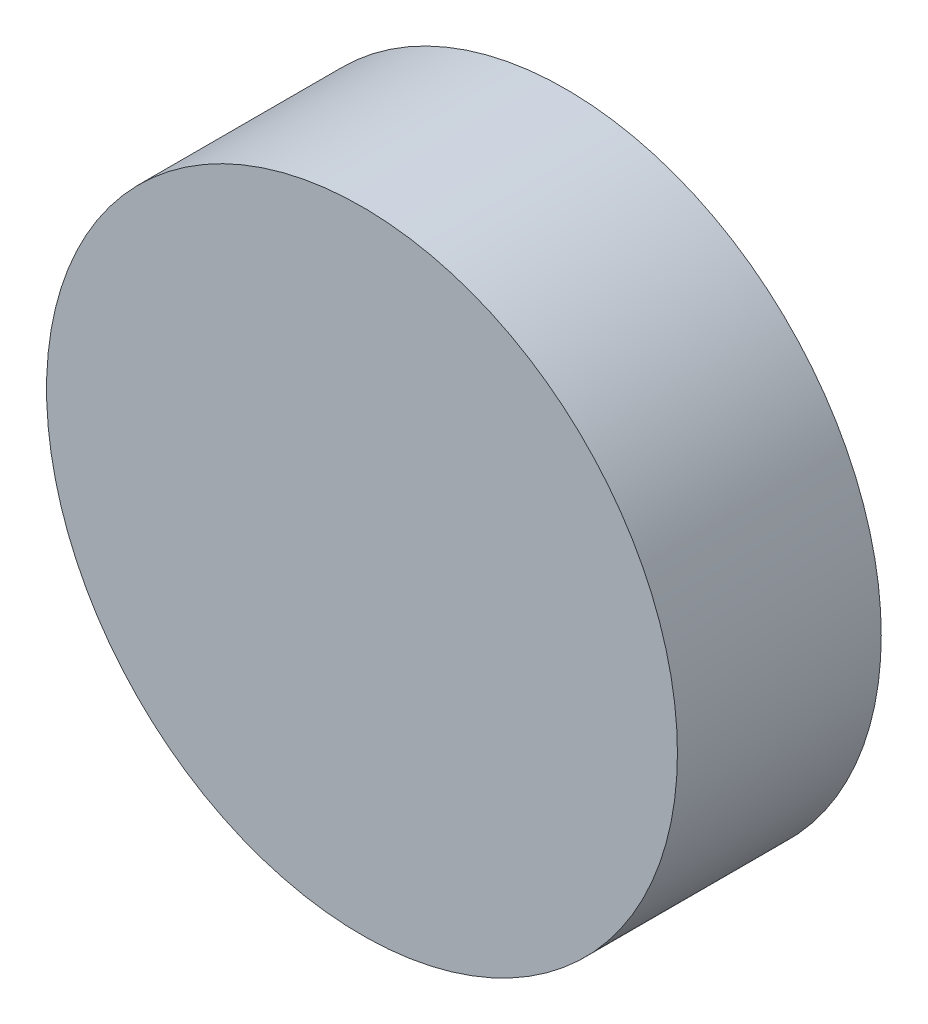
ISO-10303-21;
HEADER;
FILE_DESCRIPTION(('STEP AP214'),'2;1');
FILE_NAME('part.step','',(''),(''),'','','');
FILE_SCHEMA(('AUTOMOTIVE_DESIGN { 1 0 10303 214 1 1 1 1 }'));
ENDSEC;
DATA;
#1=APPLICATION_CONTEXT('core data for automotive mechanical design processes');
#2=APPLICATION_PROTOCOL_DEFINITION('international standard','automotive_design',2000,#1);
#3=PRODUCT_CONTEXT('',#1,'mechanical');
#4=PRODUCT('Part','Part','',(#3));
#5=PRODUCT_RELATED_PRODUCT_CATEGORY('part','',(#4));
#6=PRODUCT_DEFINITION_FORMATION('','',#4);
#7=PRODUCT_DEFINITION_CONTEXT('part definition',#1,'design');
#8=PRODUCT_DEFINITION('design','',#6,#7);
#9=PRODUCT_DEFINITION_SHAPE('','',#8);
#10=(LENGTH_UNIT() NAMED_UNIT(*) SI_UNIT(.MILLI.,.METRE.));
#11=(NAMED_UNIT(*) PLANE_ANGLE_UNIT() SI_UNIT($,.RADIAN.));
#12=(NAMED_UNIT(*) SI_UNIT($,.STERADIAN.) SOLID_ANGLE_UNIT());
#13=UNCERTAINTY_MEASURE_WITH_UNIT(LENGTH_MEASURE(1.E-05),#10,'distance_accuracy_value','');
#14=(GEOMETRIC_REPRESENTATION_CONTEXT(3) GLOBAL_UNCERTAINTY_ASSIGNED_CONTEXT((#13)) GLOBAL_UNIT_ASSIGNED_CONTEXT((#10,
#11,#12)) REPRESENTATION_CONTEXT('',''));
#15=CARTESIAN_POINT('',(0.,0.,0.));
#16=DIRECTION('',(0.,0.,1.));
#17=DIRECTION('',(1.,0.,0.));
#18=AXIS2_PLACEMENT_3D('',#15,#16,#17);
#19=CARTESIAN_POINT('',(0.,0.,0.));
#20=DIRECTION('',(0.,0.,1.));
#21=DIRECTION('',(1.,0.,0.));
#22=AXIS2_PLACEMENT_3D('',#19,#20,#21);
#23=PLANE('',#22);
#24=CARTESIAN_POINT('',(0.,0.,0.));
#25=DIRECTION('',(0.,0.,1.));
#26=DIRECTION('',(1.,0.,0.));
#27=AXIS2_PLACEMENT_3D('',#24,#25,#26);
#28=CIRCLE('',#27,6.5);
#29=CARTESIAN_POINT('',(6.5,0.,0.));
#30=VERTEX_POINT('',#29);
#31=EDGE_CURVE('E10',#30,#30,#28,.T.);
#32=ORIENTED_EDGE('',*,*,#31,.F.);
#33=EDGE_LOOP('',(#32));
#34=FACE_BOUND('',#33,.T.);
#35=CARTESIAN_POINT('',(0.,0.,0.));
#36=DIRECTION('',(0.,0.,1.));
#37=DIRECTION('',(1.,0.,0.));
#38=AXIS2_PLACEMENT_3D('',#35,#36,#37);
#39=CIRCLE('',#38,4.5);
#40=CARTESIAN_POINT('',(4.5,0.,0.));
#41=VERTEX_POINT('',#40);
#42=EDGE_CURVE('E40',#41,#41,#39,.T.);
#43=ORIENTED_EDGE('',*,*,#42,.T.);
#44=EDGE_LOOP('',(#43));
#45=FACE_BOUND('',#44,.T.);
#46=ADVANCED_FACE('F33',(#34,#45),#23,.F.);
#47=CARTESIAN_POINT('',(0.,0.,4.));
#48=DIRECTION('',(0.,0.,-1.));
#49=DIRECTION('',(-1.,0.,0.));
#50=AXIS2_PLACEMENT_3D('',#47,#48,#49);
#51=CYLINDRICAL_SURFACE('',#50,6.5);
#52=ORIENTED_EDGE('',*,*,#31,.T.);
#53=EDGE_LOOP('',(#52));
#54=FACE_BOUND('',#53,.T.);
#55=CARTESIAN_POINT('',(0.,0.,4.2));
#56=DIRECTION('',(0.,0.,1.));
#57=DIRECTION('',(1.,0.,0.));
#58=AXIS2_PLACEMENT_3D('',#55,#56,#57);
#59=CIRCLE('',#58,6.5);
#60=CARTESIAN_POINT('',(6.5,0.,4.2));
#61=VERTEX_POINT('',#60);
#62=EDGE_CURVE('E48',#61,#61,#59,.T.);
#63=ORIENTED_EDGE('',*,*,#62,.F.);
#64=EDGE_LOOP('',(#63));
#65=FACE_BOUND('',#64,.T.);
#66=ADVANCED_FACE('F35',(#54,#65),#51,.T.);
#67=CARTESIAN_POINT('',(0.,0.,4.));
#68=DIRECTION('',(0.,0.,-1.));
#69=DIRECTION('',(-1.,0.,0.));
#70=AXIS2_PLACEMENT_3D('',#67,#68,#69);
#71=CYLINDRICAL_SURFACE('',#70,4.5);
#72=CARTESIAN_POINT('',(0.,0.,4.));
#73=DIRECTION('',(0.,0.,1.));
#74=DIRECTION('',(1.,0.,0.));
#75=AXIS2_PLACEMENT_3D('',#72,#73,#74);
#76=CIRCLE('',#75,4.5);
#77=CARTESIAN_POINT('',(4.5,0.,4.));
#78=VERTEX_POINT('',#77);
#79=EDGE_CURVE('E44',#78,#78,#76,.T.);
#80=ORIENTED_EDGE('',*,*,#79,.T.);
#81=EDGE_LOOP('',(#80));
#82=FACE_BOUND('',#81,.T.);
#83=ORIENTED_EDGE('',*,*,#42,.F.);
#84=EDGE_LOOP('',(#83));
#85=FACE_BOUND('',#84,.T.);
#86=ADVANCED_FACE('F57',(#82,#85),#71,.F.);
#87=CARTESIAN_POINT('',(0.,0.,4.));
#88=DIRECTION('',(0.,0.,1.));
#89=DIRECTION('',(1.,0.,0.));
#90=AXIS2_PLACEMENT_3D('',#87,#88,#89);
#91=PLANE('',#90);
#92=ORIENTED_EDGE('',*,*,#79,.F.);
#93=EDGE_LOOP('',(#92));
#94=FACE_BOUND('',#93,.T.);
#95=ADVANCED_FACE('F62',(#94),#91,.F.);
#96=CARTESIAN_POINT('',(0.,0.,4.2));
#97=DIRECTION('',(0.,0.,1.));
#98=DIRECTION('',(1.,0.,0.));
#99=AXIS2_PLACEMENT_3D('',#96,#97,#98);
#100=PLANE('',#99);
#101=ORIENTED_EDGE('',*,*,#62,.T.);
#102=EDGE_LOOP('',(#101));
#103=FACE_BOUND('',#102,.T.);
#104=ADVANCED_FACE('F54',(#103),#100,.T.);
#105=CLOSED_SHELL('',(#46,#66,#86,#95,#104));
#106=MANIFOLD_SOLID_BREP('B2',#105);
#107=ADVANCED_BREP_SHAPE_REPRESENTATION('',(#18,#106),#14);
#108=SHAPE_DEFINITION_REPRESENTATION(#9,#107);
ENDSEC;
END-ISO-10303-21;
